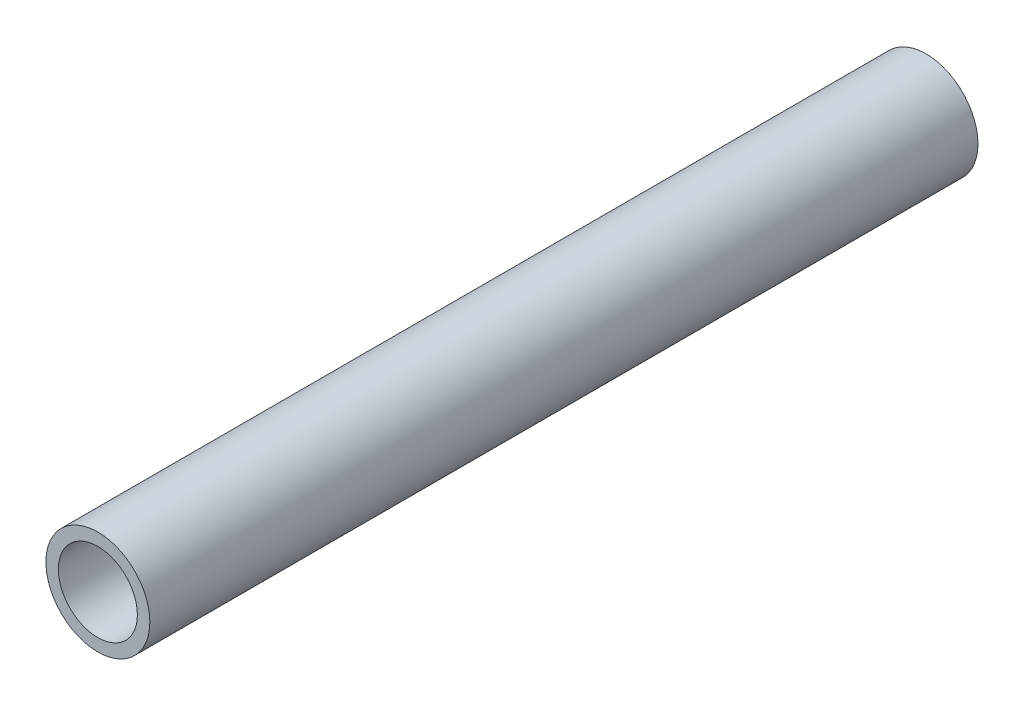
ISO-10303-21;
HEADER;
FILE_DESCRIPTION(('STEP AP214'),'2;1');
FILE_NAME('part.step','',(''),(''),'','','');
FILE_SCHEMA(('AUTOMOTIVE_DESIGN { 1 0 10303 214 1 1 1 1 }'));
ENDSEC;
DATA;
#1=APPLICATION_CONTEXT('core data for automotive mechanical design processes');
#2=APPLICATION_PROTOCOL_DEFINITION('international standard','automotive_design',2000,#1);
#3=PRODUCT_CONTEXT('',#1,'mechanical');
#4=PRODUCT('Part','Part','',(#3));
#5=PRODUCT_RELATED_PRODUCT_CATEGORY('part','',(#4));
#6=PRODUCT_DEFINITION_FORMATION('','',#4);
#7=PRODUCT_DEFINITION_CONTEXT('part definition',#1,'design');
#8=PRODUCT_DEFINITION('design','',#6,#7);
#9=PRODUCT_DEFINITION_SHAPE('','',#8);
#10=(LENGTH_UNIT() NAMED_UNIT(*) SI_UNIT(.MILLI.,.METRE.));
#11=(NAMED_UNIT(*) PLANE_ANGLE_UNIT() SI_UNIT($,.RADIAN.));
#12=(NAMED_UNIT(*) SI_UNIT($,.STERADIAN.) SOLID_ANGLE_UNIT());
#13=UNCERTAINTY_MEASURE_WITH_UNIT(LENGTH_MEASURE(1.E-05),#10,'distance_accuracy_value','');
#14=(GEOMETRIC_REPRESENTATION_CONTEXT(3) GLOBAL_UNCERTAINTY_ASSIGNED_CONTEXT((#13)) GLOBAL_UNIT_ASSIGNED_CONTEXT((#10,
#11,#12)) REPRESENTATION_CONTEXT('',''));
#15=CARTESIAN_POINT('',(0.,0.,0.));
#16=DIRECTION('',(0.,0.,1.));
#17=DIRECTION('',(1.,0.,0.));
#18=AXIS2_PLACEMENT_3D('',#15,#16,#17);
#19=CARTESIAN_POINT('',(0.,0.,266.192));
#20=DIRECTION('',(0.,0.,1.));
#21=DIRECTION('',(1.,0.,0.));
#22=AXIS2_PLACEMENT_3D('',#19,#20,#21);
#23=PLANE('',#22);
#24=CARTESIAN_POINT('',(0.,0.,266.192));
#25=DIRECTION('',(0.,0.,1.));
#26=DIRECTION('',(1.,0.,0.));
#27=AXIS2_PLACEMENT_3D('',#24,#25,#26);
#28=CIRCLE('',#27,16.7005);
#29=CARTESIAN_POINT('',(16.7005,0.,266.192));
#30=VERTEX_POINT('',#29);
#31=EDGE_CURVE('E11',#30,#30,#28,.T.);
#32=ORIENTED_EDGE('',*,*,#31,.T.);
#33=EDGE_LOOP('',(#32));
#34=FACE_BOUND('',#33,.T.);
#35=CARTESIAN_POINT('',(0.,0.,266.192));
#36=DIRECTION('',(0.,0.,1.));
#37=DIRECTION('',(1.,0.,0.));
#38=AXIS2_PLACEMENT_3D('',#35,#36,#37);
#39=CIRCLE('',#38,12.7);
#40=CARTESIAN_POINT('',(12.7,0.,266.192));
#41=VERTEX_POINT('',#40);
#42=EDGE_CURVE('E48',#41,#41,#39,.T.);
#43=ORIENTED_EDGE('',*,*,#42,.F.);
#44=EDGE_LOOP('',(#43));
#45=FACE_BOUND('',#44,.T.);
#46=ADVANCED_FACE('F37',(#34,#45),#23,.T.);
#47=CARTESIAN_POINT('',(0.,0.,0.));
#48=DIRECTION('',(0.,0.,1.));
#49=DIRECTION('',(1.,0.,0.));
#50=AXIS2_PLACEMENT_3D('',#47,#48,#49);
#51=PLANE('',#50);
#52=CARTESIAN_POINT('',(0.,0.,0.));
#53=DIRECTION('',(0.,0.,1.));
#54=DIRECTION('',(1.,0.,0.));
#55=AXIS2_PLACEMENT_3D('',#52,#53,#54);
#56=CIRCLE('',#55,16.7005);
#57=CARTESIAN_POINT('',(16.7005,0.,0.));
#58=VERTEX_POINT('',#57);
#59=EDGE_CURVE('E41',#58,#58,#56,.T.);
#60=ORIENTED_EDGE('',*,*,#59,.F.);
#61=EDGE_LOOP('',(#60));
#62=FACE_BOUND('',#61,.T.);
#63=CARTESIAN_POINT('',(0.,0.,0.));
#64=DIRECTION('',(0.,0.,1.));
#65=DIRECTION('',(1.,0.,0.));
#66=AXIS2_PLACEMENT_3D('',#63,#64,#65);
#67=CIRCLE('',#66,12.7);
#68=CARTESIAN_POINT('',(12.7,0.,0.));
#69=VERTEX_POINT('',#68);
#70=EDGE_CURVE('E50',#69,#69,#67,.T.);
#71=ORIENTED_EDGE('',*,*,#70,.T.);
#72=EDGE_LOOP('',(#71));
#73=FACE_BOUND('',#72,.T.);
#74=ADVANCED_FACE('F60',(#62,#73),#51,.F.);
#75=CARTESIAN_POINT('',(0.,0.,266.192));
#76=DIRECTION('',(0.,0.,-1.));
#77=DIRECTION('',(-1.,0.,0.));
#78=AXIS2_PLACEMENT_3D('',#75,#76,#77);
#79=CYLINDRICAL_SURFACE('',#78,16.7005);
#80=ORIENTED_EDGE('',*,*,#31,.F.);
#81=EDGE_LOOP('',(#80));
#82=FACE_BOUND('',#81,.T.);
#83=ORIENTED_EDGE('',*,*,#59,.T.);
#84=EDGE_LOOP('',(#83));
#85=FACE_BOUND('',#84,.T.);
#86=ADVANCED_FACE('F39',(#82,#85),#79,.T.);
#87=CARTESIAN_POINT('',(0.,0.,266.192));
#88=DIRECTION('',(0.,0.,-1.));
#89=DIRECTION('',(-1.,0.,0.));
#90=AXIS2_PLACEMENT_3D('',#87,#88,#89);
#91=CYLINDRICAL_SURFACE('',#90,12.7);
#92=ORIENTED_EDGE('',*,*,#42,.T.);
#93=EDGE_LOOP('',(#92));
#94=FACE_BOUND('',#93,.T.);
#95=ORIENTED_EDGE('',*,*,#70,.F.);
#96=EDGE_LOOP('',(#95));
#97=FACE_BOUND('',#96,.T.);
#98=ADVANCED_FACE('F56',(#94,#97),#91,.F.);
#99=CLOSED_SHELL('',(#46,#74,#86,#98));
#100=MANIFOLD_SOLID_BREP('B2',#99);
#101=ADVANCED_BREP_SHAPE_REPRESENTATION('',(#18,#100),#14);
#102=SHAPE_DEFINITION_REPRESENTATION(#9,#101);
ENDSEC;
END-ISO-10303-21;
